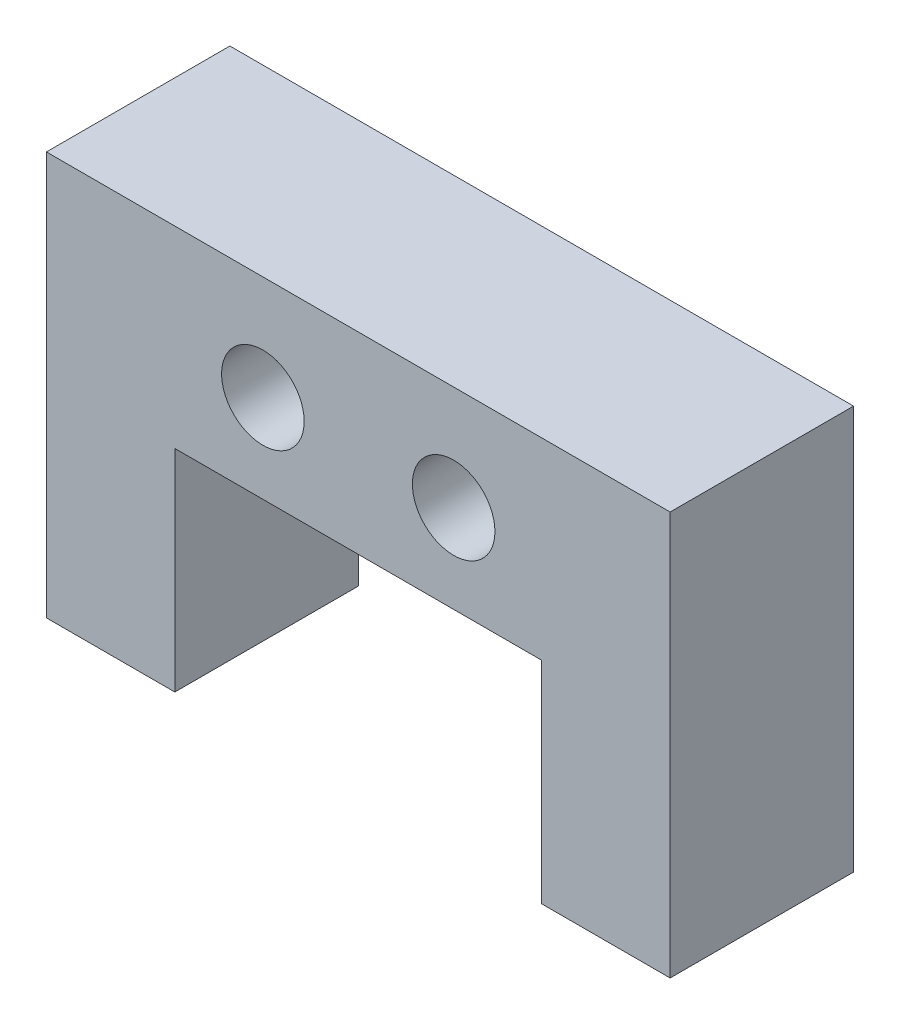
ISO-10303-21;
HEADER;
FILE_DESCRIPTION(('STEP AP214'),'2;1');
FILE_NAME('part.step','',(''),(''),'','','');
FILE_SCHEMA(('AUTOMOTIVE_DESIGN { 1 0 10303 214 1 1 1 1 }'));
ENDSEC;
DATA;
#1=APPLICATION_CONTEXT('core data for automotive mechanical design processes');
#2=APPLICATION_PROTOCOL_DEFINITION('international standard','automotive_design',2000,#1);
#3=PRODUCT_CONTEXT('',#1,'mechanical');
#4=PRODUCT('Part','Part','',(#3));
#5=PRODUCT_RELATED_PRODUCT_CATEGORY('part','',(#4));
#6=PRODUCT_DEFINITION_FORMATION('','',#4);
#7=PRODUCT_DEFINITION_CONTEXT('part definition',#1,'design');
#8=PRODUCT_DEFINITION('design','',#6,#7);
#9=PRODUCT_DEFINITION_SHAPE('','',#8);
#10=(LENGTH_UNIT() NAMED_UNIT(*) SI_UNIT(.MILLI.,.METRE.));
#11=(NAMED_UNIT(*) PLANE_ANGLE_UNIT() SI_UNIT($,.RADIAN.));
#12=(NAMED_UNIT(*) SI_UNIT($,.STERADIAN.) SOLID_ANGLE_UNIT());
#13=UNCERTAINTY_MEASURE_WITH_UNIT(LENGTH_MEASURE(1.E-05),#10,'distance_accuracy_value','');
#14=(GEOMETRIC_REPRESENTATION_CONTEXT(3) GLOBAL_UNCERTAINTY_ASSIGNED_CONTEXT((#13)) GLOBAL_UNIT_ASSIGNED_CONTEXT((#10,
#11,#12)) REPRESENTATION_CONTEXT('',''));
#15=CARTESIAN_POINT('',(0.,0.,0.));
#16=DIRECTION('',(0.,0.,1.));
#17=DIRECTION('',(1.,0.,0.));
#18=AXIS2_PLACEMENT_3D('',#15,#16,#17);
#19=CARTESIAN_POINT('',(0.,22.,10.));
#20=DIRECTION('',(0.,0.,-1.));
#21=DIRECTION('',(-1.,0.,0.));
#22=AXIS2_PLACEMENT_3D('',#19,#20,#21);
#23=PLANE('',#22);
#24=CARTESIAN_POINT('',(22.2,16.3,10.));
#25=DIRECTION('',(0.,0.,1.));
#26=DIRECTION('',(1.,0.,0.));
#27=AXIS2_PLACEMENT_3D('',#24,#25,#26);
#28=CIRCLE('',#27,2.25);
#29=CARTESIAN_POINT('',(24.45,16.3,10.));
#30=VERTEX_POINT('',#29);
#31=EDGE_CURVE('E134',#30,#30,#28,.T.);
#32=ORIENTED_EDGE('',*,*,#31,.F.);
#33=EDGE_LOOP('',(#32));
#34=FACE_BOUND('',#33,.T.);
#35=DIRECTION('',(0.,-1.,0.));
#36=VECTOR('',#35,1.);
#37=CARTESIAN_POINT('',(0.,0.,10.));
#38=LINE('',#37,#36);
#39=CARTESIAN_POINT('',(0.,22.,10.));
#40=VERTEX_POINT('',#39);
#41=CARTESIAN_POINT('',(0.,0.,10.));
#42=VERTEX_POINT('',#41);
#43=EDGE_CURVE('E145',#40,#42,#38,.T.);
#44=ORIENTED_EDGE('',*,*,#43,.T.);
#45=DIRECTION('',(1.,0.,0.));
#46=VECTOR('',#45,1.);
#47=CARTESIAN_POINT('',(0.,0.,10.));
#48=LINE('',#47,#46);
#49=CARTESIAN_POINT('',(7.,0.,10.));
#50=VERTEX_POINT('',#49);
#51=EDGE_CURVE('E93',#42,#50,#48,.T.);
#52=ORIENTED_EDGE('',*,*,#51,.T.);
#53=DIRECTION('',(0.,1.,0.));
#54=VECTOR('',#53,1.);
#55=CARTESIAN_POINT('',(7.,0.,10.));
#56=LINE('',#55,#54);
#57=CARTESIAN_POINT('',(7.,11.5,10.));
#58=VERTEX_POINT('',#57);
#59=EDGE_CURVE('E160',#50,#58,#56,.T.);
#60=ORIENTED_EDGE('',*,*,#59,.T.);
#61=DIRECTION('',(1.,0.,0.));
#62=VECTOR('',#61,1.);
#63=CARTESIAN_POINT('',(7.,11.5,10.));
#64=LINE('',#63,#62);
#65=CARTESIAN_POINT('',(27.,11.5,10.));
#66=VERTEX_POINT('',#65);
#67=EDGE_CURVE('E173',#58,#66,#64,.T.);
#68=ORIENTED_EDGE('',*,*,#67,.T.);
#69=DIRECTION('',(0.,-1.,0.));
#70=VECTOR('',#69,1.);
#71=CARTESIAN_POINT('',(27.,0.,10.));
#72=LINE('',#71,#70);
#73=CARTESIAN_POINT('',(27.,0.,10.));
#74=VERTEX_POINT('',#73);
#75=EDGE_CURVE('E112',#66,#74,#72,.T.);
#76=ORIENTED_EDGE('',*,*,#75,.T.);
#77=DIRECTION('',(1.,0.,0.));
#78=VECTOR('',#77,1.);
#79=CARTESIAN_POINT('',(27.,0.,10.));
#80=LINE('',#79,#78);
#81=CARTESIAN_POINT('',(34.,0.,10.));
#82=VERTEX_POINT('',#81);
#83=EDGE_CURVE('E106',#74,#82,#80,.T.);
#84=ORIENTED_EDGE('',*,*,#83,.T.);
#85=DIRECTION('',(0.,1.,0.));
#86=VECTOR('',#85,1.);
#87=CARTESIAN_POINT('',(34.,0.,10.));
#88=LINE('',#87,#86);
#89=CARTESIAN_POINT('',(34.,22.,10.));
#90=VERTEX_POINT('',#89);
#91=EDGE_CURVE('E110',#82,#90,#88,.T.);
#92=ORIENTED_EDGE('',*,*,#91,.T.);
#93=DIRECTION('',(-1.,0.,0.));
#94=VECTOR('',#93,1.);
#95=CARTESIAN_POINT('',(0.,22.,10.));
#96=LINE('',#95,#94);
#97=EDGE_CURVE('E50',#90,#40,#96,.T.);
#98=ORIENTED_EDGE('',*,*,#97,.T.);
#99=EDGE_LOOP('',(#44,#52,#60,#68,#76,#84,#92,#98));
#100=FACE_BOUND('',#99,.T.);
#101=CARTESIAN_POINT('',(11.8,16.3,10.));
#102=DIRECTION('',(0.,0.,1.));
#103=DIRECTION('',(1.,0.,0.));
#104=AXIS2_PLACEMENT_3D('',#101,#102,#103);
#105=CIRCLE('',#104,2.25000000000001);
#106=CARTESIAN_POINT('',(14.05,16.3,10.));
#107=VERTEX_POINT('',#106);
#108=EDGE_CURVE('E182',#107,#107,#105,.T.);
#109=ORIENTED_EDGE('',*,*,#108,.F.);
#110=EDGE_LOOP('',(#109));
#111=FACE_BOUND('',#110,.T.);
#112=ADVANCED_FACE('F33',(#34,#100,#111),#23,.F.);
#113=CARTESIAN_POINT('',(0.,22.,0.));
#114=DIRECTION('',(0.,0.,-1.));
#115=DIRECTION('',(-1.,0.,0.));
#116=AXIS2_PLACEMENT_3D('',#113,#114,#115);
#117=PLANE('',#116);
#118=CARTESIAN_POINT('',(22.2,16.3,0.));
#119=DIRECTION('',(0.,0.,1.));
#120=DIRECTION('',(1.,0.,0.));
#121=AXIS2_PLACEMENT_3D('',#118,#119,#120);
#122=CIRCLE('',#121,2.25);
#123=CARTESIAN_POINT('',(24.45,16.3,0.));
#124=VERTEX_POINT('',#123);
#125=EDGE_CURVE('E179',#124,#124,#122,.T.);
#126=ORIENTED_EDGE('',*,*,#125,.T.);
#127=EDGE_LOOP('',(#126));
#128=FACE_BOUND('',#127,.T.);
#129=DIRECTION('',(0.,-1.,0.));
#130=VECTOR('',#129,1.);
#131=CARTESIAN_POINT('',(0.,0.,0.));
#132=LINE('',#131,#130);
#133=CARTESIAN_POINT('',(0.,22.,0.));
#134=VERTEX_POINT('',#133);
#135=CARTESIAN_POINT('',(0.,0.,0.));
#136=VERTEX_POINT('',#135);
#137=EDGE_CURVE('E130',#134,#136,#132,.T.);
#138=ORIENTED_EDGE('',*,*,#137,.F.);
#139=DIRECTION('',(-1.,0.,0.));
#140=VECTOR('',#139,1.);
#141=CARTESIAN_POINT('',(0.,22.,0.));
#142=LINE('',#141,#140);
#143=CARTESIAN_POINT('',(34.,22.,0.));
#144=VERTEX_POINT('',#143);
#145=EDGE_CURVE('E85',#144,#134,#142,.T.);
#146=ORIENTED_EDGE('',*,*,#145,.F.);
#147=DIRECTION('',(0.,1.,0.));
#148=VECTOR('',#147,1.);
#149=CARTESIAN_POINT('',(34.,0.,0.));
#150=LINE('',#149,#148);
#151=CARTESIAN_POINT('',(34.,0.,0.));
#152=VERTEX_POINT('',#151);
#153=EDGE_CURVE('E79',#152,#144,#150,.T.);
#154=ORIENTED_EDGE('',*,*,#153,.F.);
#155=DIRECTION('',(1.,0.,0.));
#156=VECTOR('',#155,1.);
#157=CARTESIAN_POINT('',(27.,0.,0.));
#158=LINE('',#157,#156);
#159=CARTESIAN_POINT('',(27.,0.,0.));
#160=VERTEX_POINT('',#159);
#161=EDGE_CURVE('E120',#160,#152,#158,.T.);
#162=ORIENTED_EDGE('',*,*,#161,.F.);
#163=DIRECTION('',(0.,-1.,0.));
#164=VECTOR('',#163,1.);
#165=CARTESIAN_POINT('',(27.,0.,0.));
#166=LINE('',#165,#164);
#167=CARTESIAN_POINT('',(27.,11.5,0.));
#168=VERTEX_POINT('',#167);
#169=EDGE_CURVE('E140',#168,#160,#166,.T.);
#170=ORIENTED_EDGE('',*,*,#169,.F.);
#171=DIRECTION('',(1.,0.,0.));
#172=VECTOR('',#171,1.);
#173=CARTESIAN_POINT('',(7.,11.5,0.));
#174=LINE('',#173,#172);
#175=CARTESIAN_POINT('',(7.,11.5,0.));
#176=VERTEX_POINT('',#175);
#177=EDGE_CURVE('E138',#176,#168,#174,.T.);
#178=ORIENTED_EDGE('',*,*,#177,.F.);
#179=DIRECTION('',(0.,1.,0.));
#180=VECTOR('',#179,1.);
#181=CARTESIAN_POINT('',(7.,0.,0.));
#182=LINE('',#181,#180);
#183=CARTESIAN_POINT('',(7.,0.,0.));
#184=VERTEX_POINT('',#183);
#185=EDGE_CURVE('E136',#184,#176,#182,.T.);
#186=ORIENTED_EDGE('',*,*,#185,.F.);
#187=DIRECTION('',(1.,0.,0.));
#188=VECTOR('',#187,1.);
#189=CARTESIAN_POINT('',(0.,0.,0.));
#190=LINE('',#189,#188);
#191=EDGE_CURVE('E133',#136,#184,#190,.T.);
#192=ORIENTED_EDGE('',*,*,#191,.F.);
#193=EDGE_LOOP('',(#138,#146,#154,#162,#170,#178,#186,#192));
#194=FACE_BOUND('',#193,.T.);
#195=CARTESIAN_POINT('',(11.8,16.3,0.));
#196=DIRECTION('',(0.,0.,1.));
#197=DIRECTION('',(1.,0.,0.));
#198=AXIS2_PLACEMENT_3D('',#195,#196,#197);
#199=CIRCLE('',#198,2.25000000000001);
#200=CARTESIAN_POINT('',(14.05,16.3,0.));
#201=VERTEX_POINT('',#200);
#202=EDGE_CURVE('E185',#201,#201,#199,.T.);
#203=ORIENTED_EDGE('',*,*,#202,.T.);
#204=EDGE_LOOP('',(#203));
#205=FACE_BOUND('',#204,.T.);
#206=ADVANCED_FACE('F164',(#128,#194,#205),#117,.T.);
#207=CARTESIAN_POINT('',(0.,0.,10.));
#208=DIRECTION('',(1.,0.,0.));
#209=DIRECTION('',(0.,0.,-1.));
#210=AXIS2_PLACEMENT_3D('',#207,#208,#209);
#211=PLANE('',#210);
#212=ORIENTED_EDGE('',*,*,#137,.T.);
#213=DIRECTION('',(0.,0.,-1.));
#214=VECTOR('',#213,1.);
#215=CARTESIAN_POINT('',(0.,0.,10.));
#216=LINE('',#215,#214);
#217=EDGE_CURVE('E11',#42,#136,#216,.T.);
#218=ORIENTED_EDGE('',*,*,#217,.F.);
#219=ORIENTED_EDGE('',*,*,#43,.F.);
#220=DIRECTION('',(0.,0.,-1.));
#221=VECTOR('',#220,1.);
#222=CARTESIAN_POINT('',(0.,22.,10.));
#223=LINE('',#222,#221);
#224=EDGE_CURVE('E126',#40,#134,#223,.T.);
#225=ORIENTED_EDGE('',*,*,#224,.T.);
#226=EDGE_LOOP('',(#212,#218,#219,#225));
#227=FACE_BOUND('',#226,.T.);
#228=ADVANCED_FACE('F35',(#227),#211,.F.);
#229=CARTESIAN_POINT('',(0.,0.,10.));
#230=DIRECTION('',(0.,1.,0.));
#231=DIRECTION('',(0.,0.,1.));
#232=AXIS2_PLACEMENT_3D('',#229,#230,#231);
#233=PLANE('',#232);
#234=ORIENTED_EDGE('',*,*,#191,.T.);
#235=DIRECTION('',(0.,0.,-1.));
#236=VECTOR('',#235,1.);
#237=CARTESIAN_POINT('',(7.,0.,10.));
#238=LINE('',#237,#236);
#239=EDGE_CURVE('E42',#50,#184,#238,.T.);
#240=ORIENTED_EDGE('',*,*,#239,.F.);
#241=ORIENTED_EDGE('',*,*,#51,.F.);
#242=ORIENTED_EDGE('',*,*,#217,.T.);
#243=EDGE_LOOP('',(#234,#240,#241,#242));
#244=FACE_BOUND('',#243,.T.);
#245=ADVANCED_FACE('F218',(#244),#233,.F.);
#246=CARTESIAN_POINT('',(7.,0.,10.));
#247=DIRECTION('',(-1.,0.,0.));
#248=DIRECTION('',(0.,0.,1.));
#249=AXIS2_PLACEMENT_3D('',#246,#247,#248);
#250=PLANE('',#249);
#251=ORIENTED_EDGE('',*,*,#185,.T.);
#252=DIRECTION('',(0.,0.,-1.));
#253=VECTOR('',#252,1.);
#254=CARTESIAN_POINT('',(7.,11.5,10.));
#255=LINE('',#254,#253);
#256=EDGE_CURVE('E152',#58,#176,#255,.T.);
#257=ORIENTED_EDGE('',*,*,#256,.F.);
#258=ORIENTED_EDGE('',*,*,#59,.F.);
#259=ORIENTED_EDGE('',*,*,#239,.T.);
#260=EDGE_LOOP('',(#251,#257,#258,#259));
#261=FACE_BOUND('',#260,.T.);
#262=ADVANCED_FACE('F158',(#261),#250,.F.);
#263=CARTESIAN_POINT('',(7.,11.5,10.));
#264=DIRECTION('',(0.,1.,0.));
#265=DIRECTION('',(0.,0.,1.));
#266=AXIS2_PLACEMENT_3D('',#263,#264,#265);
#267=PLANE('',#266);
#268=ORIENTED_EDGE('',*,*,#177,.T.);
#269=DIRECTION('',(0.,0.,-1.));
#270=VECTOR('',#269,1.);
#271=CARTESIAN_POINT('',(27.,11.5,10.));
#272=LINE('',#271,#270);
#273=EDGE_CURVE('E149',#66,#168,#272,.T.);
#274=ORIENTED_EDGE('',*,*,#273,.F.);
#275=ORIENTED_EDGE('',*,*,#67,.F.);
#276=ORIENTED_EDGE('',*,*,#256,.T.);
#277=EDGE_LOOP('',(#268,#274,#275,#276));
#278=FACE_BOUND('',#277,.T.);
#279=ADVANCED_FACE('F169',(#278),#267,.F.);
#280=CARTESIAN_POINT('',(27.,0.,10.));
#281=DIRECTION('',(1.,0.,0.));
#282=DIRECTION('',(0.,0.,-1.));
#283=AXIS2_PLACEMENT_3D('',#280,#281,#282);
#284=PLANE('',#283);
#285=ORIENTED_EDGE('',*,*,#169,.T.);
#286=DIRECTION('',(0.,0.,-1.));
#287=VECTOR('',#286,1.);
#288=CARTESIAN_POINT('',(27.,0.,10.));
#289=LINE('',#288,#287);
#290=EDGE_CURVE('E121',#74,#160,#289,.T.);
#291=ORIENTED_EDGE('',*,*,#290,.F.);
#292=ORIENTED_EDGE('',*,*,#75,.F.);
#293=ORIENTED_EDGE('',*,*,#273,.T.);
#294=EDGE_LOOP('',(#285,#291,#292,#293));
#295=FACE_BOUND('',#294,.T.);
#296=ADVANCED_FACE('F172',(#295),#284,.F.);
#297=CARTESIAN_POINT('',(27.,0.,10.));
#298=DIRECTION('',(0.,1.,0.));
#299=DIRECTION('',(0.,0.,1.));
#300=AXIS2_PLACEMENT_3D('',#297,#298,#299);
#301=PLANE('',#300);
#302=ORIENTED_EDGE('',*,*,#161,.T.);
#303=DIRECTION('',(0.,0.,-1.));
#304=VECTOR('',#303,1.);
#305=CARTESIAN_POINT('',(34.,0.,10.));
#306=LINE('',#305,#304);
#307=EDGE_CURVE('E117',#82,#152,#306,.T.);
#308=ORIENTED_EDGE('',*,*,#307,.F.);
#309=ORIENTED_EDGE('',*,*,#83,.F.);
#310=ORIENTED_EDGE('',*,*,#290,.T.);
#311=EDGE_LOOP('',(#302,#308,#309,#310));
#312=FACE_BOUND('',#311,.T.);
#313=ADVANCED_FACE('F118',(#312),#301,.F.);
#314=CARTESIAN_POINT('',(34.,0.,10.));
#315=DIRECTION('',(-1.,0.,0.));
#316=DIRECTION('',(0.,0.,1.));
#317=AXIS2_PLACEMENT_3D('',#314,#315,#316);
#318=PLANE('',#317);
#319=ORIENTED_EDGE('',*,*,#153,.T.);
#320=DIRECTION('',(0.,0.,-1.));
#321=VECTOR('',#320,1.);
#322=CARTESIAN_POINT('',(34.,22.,10.));
#323=LINE('',#322,#321);
#324=EDGE_CURVE('E122',#90,#144,#323,.T.);
#325=ORIENTED_EDGE('',*,*,#324,.F.);
#326=ORIENTED_EDGE('',*,*,#91,.F.);
#327=ORIENTED_EDGE('',*,*,#307,.T.);
#328=EDGE_LOOP('',(#319,#325,#326,#327));
#329=FACE_BOUND('',#328,.T.);
#330=ADVANCED_FACE('F124',(#329),#318,.F.);
#331=CARTESIAN_POINT('',(0.,22.,10.));
#332=DIRECTION('',(0.,-1.,0.));
#333=DIRECTION('',(0.,0.,-1.));
#334=AXIS2_PLACEMENT_3D('',#331,#332,#333);
#335=PLANE('',#334);
#336=ORIENTED_EDGE('',*,*,#145,.T.);
#337=ORIENTED_EDGE('',*,*,#224,.F.);
#338=ORIENTED_EDGE('',*,*,#97,.F.);
#339=ORIENTED_EDGE('',*,*,#324,.T.);
#340=EDGE_LOOP('',(#336,#337,#338,#339));
#341=FACE_BOUND('',#340,.T.);
#342=ADVANCED_FACE('F206',(#341),#335,.F.);
#343=CARTESIAN_POINT('',(22.2,16.3,10.));
#344=DIRECTION('',(0.,0.,-1.));
#345=DIRECTION('',(-1.,0.,0.));
#346=AXIS2_PLACEMENT_3D('',#343,#344,#345);
#347=CYLINDRICAL_SURFACE('',#346,2.25);
#348=ORIENTED_EDGE('',*,*,#31,.T.);
#349=EDGE_LOOP('',(#348));
#350=FACE_BOUND('',#349,.T.);
#351=ORIENTED_EDGE('',*,*,#125,.F.);
#352=EDGE_LOOP('',(#351));
#353=FACE_BOUND('',#352,.T.);
#354=ADVANCED_FACE('F203',(#350,#353),#347,.F.);
#355=CARTESIAN_POINT('',(11.8,16.3,10.));
#356=DIRECTION('',(0.,0.,-1.));
#357=DIRECTION('',(-1.,0.,0.));
#358=AXIS2_PLACEMENT_3D('',#355,#356,#357);
#359=CYLINDRICAL_SURFACE('',#358,2.25000000000001);
#360=ORIENTED_EDGE('',*,*,#108,.T.);
#361=EDGE_LOOP('',(#360));
#362=FACE_BOUND('',#361,.T.);
#363=ORIENTED_EDGE('',*,*,#202,.F.);
#364=EDGE_LOOP('',(#363));
#365=FACE_BOUND('',#364,.T.);
#366=ADVANCED_FACE('F191',(#362,#365),#359,.F.);
#367=CLOSED_SHELL('',(#112,#206,#228,#245,#262,#279,#296,#313,#330,#342,#354,#366));
#368=MANIFOLD_SOLID_BREP('B2',#367);
#369=ADVANCED_BREP_SHAPE_REPRESENTATION('',(#18,#368),#14);
#370=SHAPE_DEFINITION_REPRESENTATION(#9,#369);
ENDSEC;
END-ISO-10303-21;
